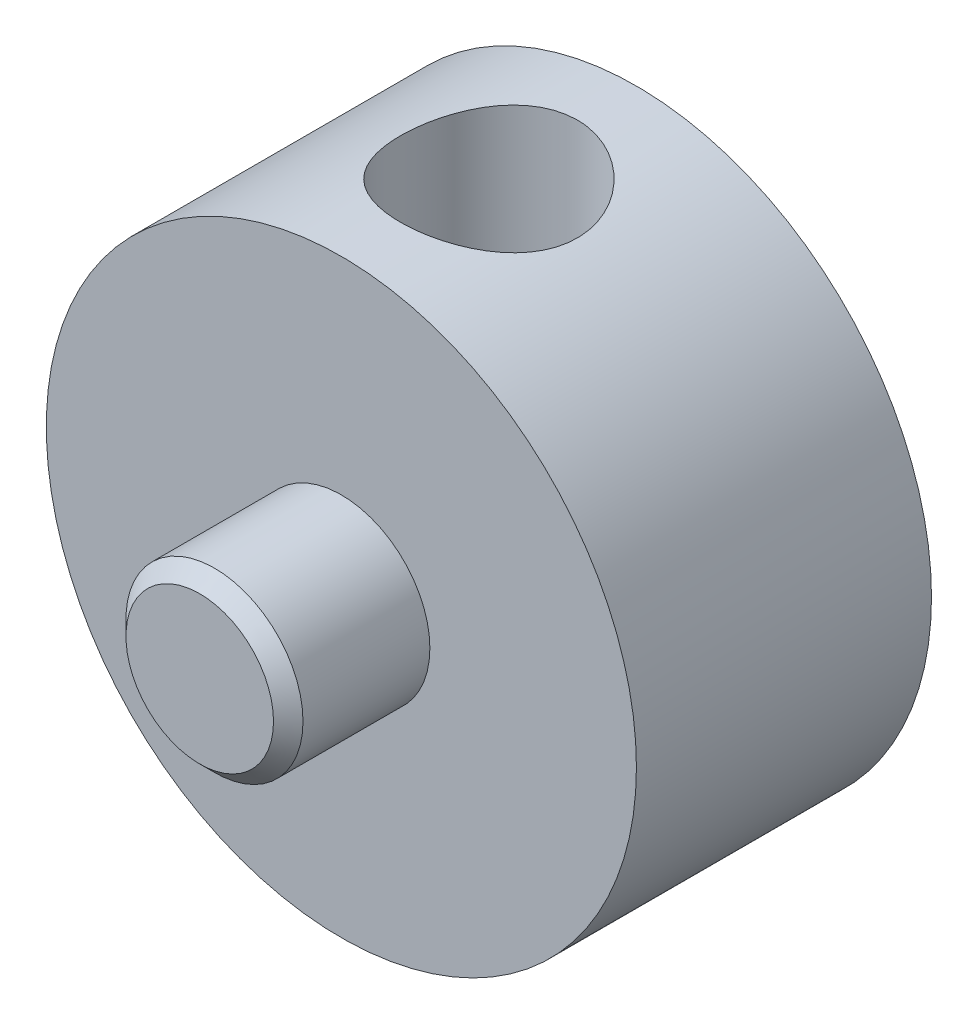
ISO-10303-21;
HEADER;
FILE_DESCRIPTION(('STEP AP214'),'2;1');
FILE_NAME('part.step','',(''),(''),'','','');
FILE_SCHEMA(('AUTOMOTIVE_DESIGN { 1 0 10303 214 1 1 1 1 }'));
ENDSEC;
DATA;
#1=APPLICATION_CONTEXT('core data for automotive mechanical design processes');
#2=APPLICATION_PROTOCOL_DEFINITION('international standard','automotive_design',2000,#1);
#3=PRODUCT_CONTEXT('',#1,'mechanical');
#4=PRODUCT('Part','Part','',(#3));
#5=PRODUCT_RELATED_PRODUCT_CATEGORY('part','',(#4));
#6=PRODUCT_DEFINITION_FORMATION('','',#4);
#7=PRODUCT_DEFINITION_CONTEXT('part definition',#1,'design');
#8=PRODUCT_DEFINITION('design','',#6,#7);
#9=PRODUCT_DEFINITION_SHAPE('','',#8);
#10=(LENGTH_UNIT() NAMED_UNIT(*) SI_UNIT(.MILLI.,.METRE.));
#11=(NAMED_UNIT(*) PLANE_ANGLE_UNIT() SI_UNIT($,.RADIAN.));
#12=(NAMED_UNIT(*) SI_UNIT($,.STERADIAN.) SOLID_ANGLE_UNIT());
#13=UNCERTAINTY_MEASURE_WITH_UNIT(LENGTH_MEASURE(1.E-05),#10,'distance_accuracy_value','');
#14=(GEOMETRIC_REPRESENTATION_CONTEXT(3) GLOBAL_UNCERTAINTY_ASSIGNED_CONTEXT((#13)) GLOBAL_UNIT_ASSIGNED_CONTEXT((#10,
#11,#12)) REPRESENTATION_CONTEXT('',''));
#15=CARTESIAN_POINT('',(0.,0.,0.));
#16=DIRECTION('',(0.,0.,1.));
#17=DIRECTION('',(1.,0.,0.));
#18=AXIS2_PLACEMENT_3D('',#15,#16,#17);
#19=CARTESIAN_POINT('',(0.,0.,10.));
#20=DIRECTION('',(0.,0.,-1.));
#21=DIRECTION('',(-1.,0.,0.));
#22=AXIS2_PLACEMENT_3D('',#19,#20,#21);
#23=CYLINDRICAL_SURFACE('',#22,10.);
#24=CARTESIAN_POINT('',(0.,0.,10.));
#25=DIRECTION('',(0.,0.,1.));
#26=DIRECTION('',(1.,0.,0.));
#27=AXIS2_PLACEMENT_3D('',#24,#25,#26);
#28=CIRCLE('',#27,10.);
#29=CARTESIAN_POINT('',(10.,0.,10.));
#30=VERTEX_POINT('',#29);
#31=EDGE_CURVE('E77',#30,#30,#28,.T.);
#32=ORIENTED_EDGE('',*,*,#31,.F.);
#33=EDGE_LOOP('',(#32));
#34=FACE_BOUND('',#33,.T.);
#35=CARTESIAN_POINT('',(0.,0.,0.));
#36=DIRECTION('',(0.,0.,1.));
#37=DIRECTION('',(1.,0.,0.));
#38=AXIS2_PLACEMENT_3D('',#35,#36,#37);
#39=CIRCLE('',#38,10.);
#40=CARTESIAN_POINT('',(10.,0.,0.));
#41=VERTEX_POINT('',#40);
#42=EDGE_CURVE('E78',#41,#41,#39,.T.);
#43=ORIENTED_EDGE('',*,*,#42,.T.);
#44=EDGE_LOOP('',(#43));
#45=FACE_BOUND('',#44,.T.);
#46=CARTESIAN_POINT('',(0.,10.,2.));
#47=CARTESIAN_POINT('',(-0.1645772255066,9.99999858501101,2.00000199496977));
#48=CARTESIAN_POINT('',(-0.329174636703059,9.99589831387907,2.01358772724793));
#49=CARTESIAN_POINT('',(-0.653576250609761,9.97994211187382,2.0674427084442));
#50=CARTESIAN_POINT('',(-0.81337900882284,9.96808386779384,2.10771991604668));
#51=CARTESIAN_POINT('',(-1.12346541550905,9.93791105003673,2.21349203382053));
#52=CARTESIAN_POINT('',(-1.27376272879075,9.91960600500851,2.27894973923787));
#53=CARTESIAN_POINT('',(-1.56124836210626,9.87844218475291,2.43307218611167));
#54=CARTESIAN_POINT('',(-1.69843493493934,9.85558280384133,2.52174001479083));
#55=CARTESIAN_POINT('',(-1.95974359436749,9.80701474385548,2.72244801494534));
#56=CARTESIAN_POINT('',(-2.08343614248868,9.78124767314073,2.83503325177183));
#57=CARTESIAN_POINT('',(-2.31049841846647,9.73011668420884,3.07921845982037));
#58=CARTESIAN_POINT('',(-2.41386472654881,9.70475283449003,3.21082162424992));
#59=CARTESIAN_POINT('',(-2.59960075447415,9.65668227987544,3.49294150607522));
#60=CARTESIAN_POINT('',(-2.68144618044427,9.63404813327749,3.64381692198147));
#61=CARTESIAN_POINT('',(-2.81842789549521,9.59487240788062,3.95797850846058));
#62=CARTESIAN_POINT('',(-2.87357059839946,9.57832936626621,4.12126168785595));
#63=CARTESIAN_POINT('',(-2.95403267365303,9.55381741676868,4.45078053226092));
#64=CARTESIAN_POINT('',(-2.98014392469355,9.54562138649067,4.61680548772789));
#65=CARTESIAN_POINT('',(-3.00427461229344,9.53805579499534,4.95106631243353));
#66=CARTESIAN_POINT('',(-3.00230085522157,9.53868409521142,5.11930163611817));
#67=CARTESIAN_POINT('',(-2.97093954399623,9.54849488135555,5.44676781721697));
#68=CARTESIAN_POINT('',(-2.9425441052537,9.55736777198281,5.60610450072448));
#69=CARTESIAN_POINT('',(-2.86074840854112,9.58216712457248,5.91763957254692));
#70=CARTESIAN_POINT('',(-2.80734568283282,9.59809428264701,6.06983725474867));
#71=CARTESIAN_POINT('',(-2.67632053307363,9.63545466149946,6.36520069932148));
#72=CARTESIAN_POINT('',(-2.59837633869285,9.65696032231904,6.50821416791052));
#73=CARTESIAN_POINT('',(-2.42070445177367,9.70301974000129,6.77946404402038));
#74=CARTESIAN_POINT('',(-2.32097148005177,9.72757423493982,6.90769685882756));
#75=CARTESIAN_POINT('',(-2.09762581531093,9.77822022595875,7.15137238152404));
#76=CARTESIAN_POINT('',(-1.97318981493394,9.80433308620996,7.26605732805934));
#77=CARTESIAN_POINT('',(-1.70652651862793,9.85424488126517,7.4731079681285));
#78=CARTESIAN_POINT('',(-1.56429810372177,9.8780436703682,7.56547225682885));
#79=CARTESIAN_POINT('',(-1.26471007668561,9.92086320138941,7.72571984492946));
#80=CARTESIAN_POINT('',(-1.1072554994959,9.93985087336628,7.79343503249972));
#81=CARTESIAN_POINT('',(-0.782490831207038,9.97067043664444,7.90119918019926));
#82=CARTESIAN_POINT('',(-0.615183503179162,9.98250432373999,7.94125585706498));
#83=CARTESIAN_POINT('',(-0.281904485336662,9.99736729287077,7.99130435579879));
#84=CARTESIAN_POINT('',(-0.116100195202373,10.0006970083558,8.00232317160322));
#85=CARTESIAN_POINT('',(0.214999211646767,9.99905846483519,7.99686168857584));
#86=CARTESIAN_POINT('',(0.380294393381562,9.99409131355514,7.98038506069711));
#87=CARTESIAN_POINT('',(0.701807210619394,9.97661393974325,7.92123077777701));
#88=CARTESIAN_POINT('',(0.858145545228339,9.96427659598829,7.87915322483826));
#89=CARTESIAN_POINT('',(1.16150927790904,9.9334869568307,7.7707135344436));
#90=CARTESIAN_POINT('',(1.30853355405117,9.91503392642188,7.70434847792428));
#91=CARTESIAN_POINT('',(1.5928743789221,9.87339308702631,7.54749366903773));
#92=CARTESIAN_POINT('',(1.72988765239934,9.8501056165928,7.45648131810404));
#93=CARTESIAN_POINT('',(1.9870466159603,9.80146937528705,7.25355049189439));
#94=CARTESIAN_POINT('',(2.10718806471188,9.7761200886242,7.1416267762247));
#95=CARTESIAN_POINT('',(2.33171489102052,9.72506343738007,6.89522538326126));
#96=CARTESIAN_POINT('',(2.43536962463001,9.69937650065513,6.76007624845635));
#97=CARTESIAN_POINT('',(2.61857990144313,9.65153030477949,6.47374412197311));
#98=CARTESIAN_POINT('',(2.69813607658965,9.62937095313121,6.32256155088424));
#99=CARTESIAN_POINT('',(2.83034694254316,9.5913437922631,6.00893501748996));
#100=CARTESIAN_POINT('',(2.88312693874021,9.57544675673501,5.84654762692433));
#101=CARTESIAN_POINT('',(2.96043461630306,9.55183188739737,5.51462406213953));
#102=CARTESIAN_POINT('',(2.98497197957849,9.54411125069387,5.34509035843393));
#103=CARTESIAN_POINT('',(3.0044396896993,9.53799944941558,5.01127696322316));
#104=CARTESIAN_POINT('',(3.00056110615887,9.53923294700395,4.84707269790116));
#105=CARTESIAN_POINT('',(2.9661501088861,9.54998802392188,4.52177179319877));
#106=CARTESIAN_POINT('',(2.93561876249408,9.55950927135902,4.36067502963898));
#107=CARTESIAN_POINT('',(2.84953777608686,9.58551527389243,4.04810920173665));
#108=CARTESIAN_POINT('',(2.79430351014248,9.60191209104934,3.89654542528261));
#109=CARTESIAN_POINT('',(2.66063014242147,9.63980557805266,3.60471512235856));
#110=CARTESIAN_POINT('',(2.58218659925722,9.6613032238508,3.46445076471685));
#111=CARTESIAN_POINT('',(2.40097527610175,9.70795352855338,3.19367376694747));
#112=CARTESIAN_POINT('',(2.29742552185996,9.7332108032858,3.06370247747963));
#113=CARTESIAN_POINT('',(2.07034869259555,9.78402640899066,2.82259500338382));
#114=CARTESIAN_POINT('',(1.94681643426898,9.80958481647543,2.71146372106436));
#115=CARTESIAN_POINT('',(1.67893152436652,9.85901873141573,2.50795317541007));
#116=CARTESIAN_POINT('',(1.53407577158122,9.88282319531421,2.41621710628906));
#117=CARTESIAN_POINT('',(1.23028274796705,9.92521360911553,2.25852966019192));
#118=CARTESIAN_POINT('',(1.07135210599791,9.94380199862114,2.19256622345098));
#119=CARTESIAN_POINT('',(0.761515425310564,9.97204349938619,2.09420944869451));
#120=CARTESIAN_POINT('',(0.611573923908468,9.9824405476214,2.05897665423351));
#121=CARTESIAN_POINT('',(0.307760390461558,9.9964188898898,2.01187294951684));
#122=CARTESIAN_POINT('',(0.153889019716279,10.0000013230948,1.99999813459036));
#123=CARTESIAN_POINT('',(0.,10.,2.));
#124=B_SPLINE_CURVE_WITH_KNOTS('',3,(#46,#47,#48,#49,#50,#51,#52,#53,#54,#55,#56,#57,#58,#59,
#60,#61,#62,#63,#64,#65,#66,#67,#68,#69,#70,#71,#72,#73,#74,#75,#76,#77,#78,#79,#80,#81,#82,#83,
#84,#85,#86,#87,#88,#89,#90,#91,#92,#93,#94,#95,#96,#97,#98,#99,#100,#101,#102,#103,#104,#105,
#106,#107,#108,#109,#110,#111,#112,#113,#114,#115,#116,#117,#118,#119,#120,#121,#122,#123),
.UNSPECIFIED.,.T.,.F.,(4,2,2,2,2,2,2,2,2,2,2,2,2,2,2,2,2,2,2,2,2,2,2,2,2,2,2,2,2,2,2,2,2,2,2,2,
2,2,4),(0.,0.493166407225221,0.986479929691999,1.47906735260175,1.9717203288254,
2.47711205896383,2.98258874577266,3.49942962008218,4.01614629086447,4.51839378713198,
5.02051956638179,5.50452033395352,5.98856887316002,6.47924852894239,6.97004720317111,
7.48134208096333,7.99266913062143,8.50742093763377,9.02202907057615,9.5181761887709,
10.0142570710065,10.4991349336465,10.9840710918746,11.4802261140582,11.9765056400038,
12.4908080064564,13.0050968850536,13.516956299025,14.0286401892057,14.5190031093854,
15.0093463933232,15.4936008081456,15.9779479511533,16.4799385136898,16.9820594980412,
17.4988599232246,18.0154182319959,18.4766338387004,18.9377723390687),.UNSPECIFIED.);
#125=CARTESIAN_POINT('',(0.,10.,2.));
#126=VERTEX_POINT('',#125);
#127=EDGE_CURVE('E10',#126,#126,#124,.T.);
#128=ORIENTED_EDGE('',*,*,#127,.F.);
#129=EDGE_LOOP('',(#128));
#130=FACE_BOUND('',#129,.T.);
#131=ADVANCED_FACE('F39',(#34,#45,#130),#23,.T.);
#132=CARTESIAN_POINT('',(0.,0.,10.));
#133=DIRECTION('',(0.,0.,1.));
#134=DIRECTION('',(1.,0.,0.));
#135=AXIS2_PLACEMENT_3D('',#132,#133,#134);
#136=PLANE('',#135);
#137=CARTESIAN_POINT('',(0.,0.,10.));
#138=DIRECTION('',(0.,0.,1.));
#139=DIRECTION('',(1.,0.,0.));
#140=AXIS2_PLACEMENT_3D('',#137,#138,#139);
#141=CIRCLE('',#140,3.);
#142=CARTESIAN_POINT('',(3.,0.,10.));
#143=VERTEX_POINT('',#142);
#144=EDGE_CURVE('E82',#143,#143,#141,.F.);
#145=ORIENTED_EDGE('',*,*,#144,.T.);
#146=EDGE_LOOP('',(#145));
#147=FACE_BOUND('',#146,.T.);
#148=ORIENTED_EDGE('',*,*,#31,.T.);
#149=EDGE_LOOP('',(#148));
#150=FACE_BOUND('',#149,.T.);
#151=ADVANCED_FACE('F108',(#147,#150),#136,.T.);
#152=CARTESIAN_POINT('',(0.,0.,0.));
#153=DIRECTION('',(0.,0.,1.));
#154=DIRECTION('',(1.,0.,0.));
#155=AXIS2_PLACEMENT_3D('',#152,#153,#154);
#156=PLANE('',#155);
#157=CARTESIAN_POINT('',(0.,0.,0.));
#158=DIRECTION('',(0.,0.,1.));
#159=DIRECTION('',(1.,0.,0.));
#160=AXIS2_PLACEMENT_3D('',#157,#158,#159);
#161=CIRCLE('',#160,3.);
#162=CARTESIAN_POINT('',(3.,0.,0.));
#163=VERTEX_POINT('',#162);
#164=EDGE_CURVE('E73',#163,#163,#161,.F.);
#165=ORIENTED_EDGE('',*,*,#164,.F.);
#166=EDGE_LOOP('',(#165));
#167=FACE_BOUND('',#166,.T.);
#168=ORIENTED_EDGE('',*,*,#42,.F.);
#169=EDGE_LOOP('',(#168));
#170=FACE_BOUND('',#169,.T.);
#171=ADVANCED_FACE('F113',(#167,#170),#156,.F.);
#172=CARTESIAN_POINT('',(0.,0.,-4.8));
#173=DIRECTION('',(0.,0.,1.));
#174=DIRECTION('',(1.,0.,0.));
#175=AXIS2_PLACEMENT_3D('',#172,#173,#174);
#176=PLANE('',#175);
#177=CARTESIAN_POINT('',(0.,0.,-4.8));
#178=DIRECTION('',(0.,0.,1.));
#179=DIRECTION('',(1.,0.,0.));
#180=AXIS2_PLACEMENT_3D('',#177,#178,#179);
#181=CIRCLE('',#180,2.49999999999999);
#182=CARTESIAN_POINT('',(2.49999999999999,0.,-4.8));
#183=VERTEX_POINT('',#182);
#184=EDGE_CURVE('E53',#183,#183,#181,.F.);
#185=ORIENTED_EDGE('',*,*,#184,.T.);
#186=EDGE_LOOP('',(#185));
#187=FACE_BOUND('',#186,.T.);
#188=ADVANCED_FACE('F144',(#187),#176,.F.);
#189=CARTESIAN_POINT('',(0.,0.,14.8));
#190=DIRECTION('',(0.,0.,-1.));
#191=DIRECTION('',(-1.,0.,0.));
#192=AXIS2_PLACEMENT_3D('',#189,#190,#191);
#193=CYLINDRICAL_SURFACE('',#192,3.);
#194=CARTESIAN_POINT('',(0.,0.,-4.29999999999999));
#195=DIRECTION('',(0.,0.,1.));
#196=DIRECTION('',(1.,0.,0.));
#197=AXIS2_PLACEMENT_3D('',#194,#195,#196);
#198=CIRCLE('',#197,3.);
#199=CARTESIAN_POINT('',(3.,0.,-4.29999999999999));
#200=VERTEX_POINT('',#199);
#201=EDGE_CURVE('E58',#200,#200,#198,.T.);
#202=ORIENTED_EDGE('',*,*,#201,.T.);
#203=EDGE_LOOP('',(#202));
#204=FACE_BOUND('',#203,.T.);
#205=ORIENTED_EDGE('',*,*,#164,.T.);
#206=EDGE_LOOP('',(#205));
#207=FACE_BOUND('',#206,.T.);
#208=ADVANCED_FACE('F137',(#204,#207),#193,.T.);
#209=CARTESIAN_POINT('',(0.,0.,14.3));
#210=DIRECTION('',(0.,0.,1.));
#211=DIRECTION('',(1.,0.,0.));
#212=AXIS2_PLACEMENT_3D('',#209,#210,#211);
#213=CIRCLE('',#212,3.);
#214=CARTESIAN_POINT('',(3.,0.,14.3));
#215=VERTEX_POINT('',#214);
#216=EDGE_CURVE('E63',#215,#215,#213,.F.);
#217=ORIENTED_EDGE('',*,*,#216,.T.);
#218=EDGE_LOOP('',(#217));
#219=FACE_BOUND('',#218,.T.);
#220=ORIENTED_EDGE('',*,*,#144,.F.);
#221=EDGE_LOOP('',(#220));
#222=FACE_BOUND('',#221,.T.);
#223=ADVANCED_FACE('F129',(#219,#222),#193,.T.);
#224=CARTESIAN_POINT('',(0.,0.,14.8));
#225=DIRECTION('',(0.,0.,1.));
#226=DIRECTION('',(1.,0.,0.));
#227=AXIS2_PLACEMENT_3D('',#224,#225,#226);
#228=PLANE('',#227);
#229=CARTESIAN_POINT('',(0.,0.,14.8));
#230=DIRECTION('',(0.,0.,1.));
#231=DIRECTION('',(1.,0.,0.));
#232=AXIS2_PLACEMENT_3D('',#229,#230,#231);
#233=CIRCLE('',#232,2.5);
#234=CARTESIAN_POINT('',(2.5,0.,14.8));
#235=VERTEX_POINT('',#234);
#236=EDGE_CURVE('E69',#235,#235,#233,.T.);
#237=ORIENTED_EDGE('',*,*,#236,.T.);
#238=EDGE_LOOP('',(#237));
#239=FACE_BOUND('',#238,.T.);
#240=ADVANCED_FACE('F124',(#239),#228,.T.);
#241=CARTESIAN_POINT('',(0.,0.,14.8));
#242=DIRECTION('',(0.,0.,-1.));
#243=DIRECTION('',(-1.,0.,0.));
#244=AXIS2_PLACEMENT_3D('',#241,#242,#243);
#245=CONICAL_SURFACE('',#244,2.5,0.785398163397451);
#246=ORIENTED_EDGE('',*,*,#216,.F.);
#247=EDGE_LOOP('',(#246));
#248=FACE_BOUND('',#247,.T.);
#249=ORIENTED_EDGE('',*,*,#236,.F.);
#250=EDGE_LOOP('',(#249));
#251=FACE_BOUND('',#250,.T.);
#252=ADVANCED_FACE('F103',(#248,#251),#245,.T.);
#253=CARTESIAN_POINT('',(0.,0.,-4.29999999999999));
#254=DIRECTION('',(0.,0.,1.));
#255=DIRECTION('',(1.,0.,0.));
#256=AXIS2_PLACEMENT_3D('',#253,#254,#255);
#257=CONICAL_SURFACE('',#256,3.,0.785398163397449);
#258=ORIENTED_EDGE('',*,*,#184,.F.);
#259=EDGE_LOOP('',(#258));
#260=FACE_BOUND('',#259,.T.);
#261=ORIENTED_EDGE('',*,*,#201,.F.);
#262=EDGE_LOOP('',(#261));
#263=FACE_BOUND('',#262,.T.);
#264=ADVANCED_FACE('F42',(#260,#263),#257,.T.);
#265=CARTESIAN_POINT('',(0.,10.,5.));
#266=DIRECTION('',(0.,-1.,0.));
#267=DIRECTION('',(0.,0.,-1.));
#268=AXIS2_PLACEMENT_3D('',#265,#266,#267);
#269=CYLINDRICAL_SURFACE('',#268,3.);
#270=CARTESIAN_POINT('',(0.,0.5,5.));
#271=DIRECTION('',(0.,1.,0.));
#272=DIRECTION('',(0.,0.,1.));
#273=AXIS2_PLACEMENT_3D('',#270,#271,#272);
#274=CIRCLE('',#273,3.);
#275=CARTESIAN_POINT('',(0.,0.5,8.));
#276=VERTEX_POINT('',#275);
#277=EDGE_CURVE('E89',#276,#276,#274,.T.);
#278=ORIENTED_EDGE('',*,*,#277,.F.);
#279=EDGE_LOOP('',(#278));
#280=FACE_BOUND('',#279,.T.);
#281=ORIENTED_EDGE('',*,*,#127,.T.);
#282=EDGE_LOOP('',(#281));
#283=FACE_BOUND('',#282,.T.);
#284=ADVANCED_FACE('F96',(#280,#283),#269,.F.);
#285=CARTESIAN_POINT('',(0.,0.5,5.));
#286=DIRECTION('',(0.,1.,0.));
#287=DIRECTION('',(0.,0.,1.));
#288=AXIS2_PLACEMENT_3D('',#285,#286,#287);
#289=PLANE('',#288);
#290=ORIENTED_EDGE('',*,*,#277,.T.);
#291=EDGE_LOOP('',(#290));
#292=FACE_BOUND('',#291,.T.);
#293=ADVANCED_FACE('F94',(#292),#289,.T.);
#294=CLOSED_SHELL('',(#131,#151,#171,#188,#208,#223,#240,#252,#264,#284,#293));
#295=MANIFOLD_SOLID_BREP('B2',#294);
#296=ADVANCED_BREP_SHAPE_REPRESENTATION('',(#18,#295),#14);
#297=SHAPE_DEFINITION_REPRESENTATION(#9,#296);
ENDSEC;
END-ISO-10303-21;
